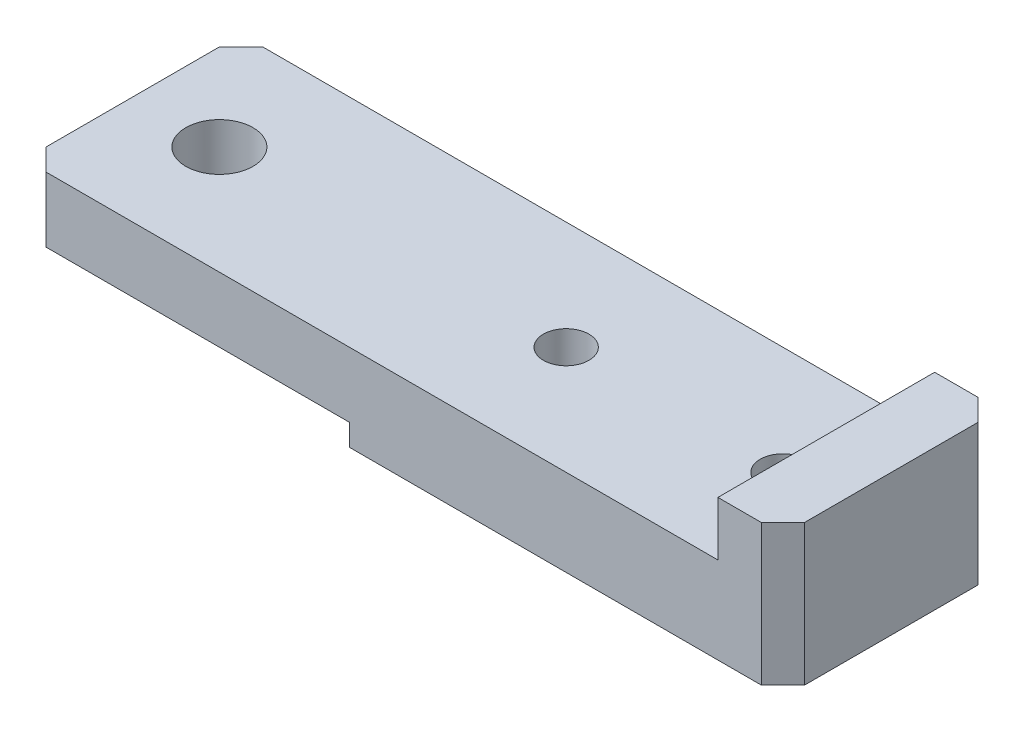
ISO-10303-21;
HEADER;
FILE_DESCRIPTION(('STEP AP214'),'2;1');
FILE_NAME('part.step','',(''),(''),'','','');
FILE_SCHEMA(('AUTOMOTIVE_DESIGN { 1 0 10303 214 1 1 1 1 }'));
ENDSEC;
DATA;
#1=APPLICATION_CONTEXT('core data for automotive mechanical design processes');
#2=APPLICATION_PROTOCOL_DEFINITION('international standard','automotive_design',2000,#1);
#3=PRODUCT_CONTEXT('',#1,'mechanical');
#4=PRODUCT('Part','Part','',(#3));
#5=PRODUCT_RELATED_PRODUCT_CATEGORY('part','',(#4));
#6=PRODUCT_DEFINITION_FORMATION('','',#4);
#7=PRODUCT_DEFINITION_CONTEXT('part definition',#1,'design');
#8=PRODUCT_DEFINITION('design','',#6,#7);
#9=PRODUCT_DEFINITION_SHAPE('','',#8);
#10=(LENGTH_UNIT() NAMED_UNIT(*) SI_UNIT(.MILLI.,.METRE.));
#11=(NAMED_UNIT(*) PLANE_ANGLE_UNIT() SI_UNIT($,.RADIAN.));
#12=(NAMED_UNIT(*) SI_UNIT($,.STERADIAN.) SOLID_ANGLE_UNIT());
#13=UNCERTAINTY_MEASURE_WITH_UNIT(LENGTH_MEASURE(1.E-05),#10,'distance_accuracy_value','');
#14=(GEOMETRIC_REPRESENTATION_CONTEXT(3) GLOBAL_UNCERTAINTY_ASSIGNED_CONTEXT((#13)) GLOBAL_UNIT_ASSIGNED_CONTEXT((#10,
#11,#12)) REPRESENTATION_CONTEXT('',''));
#15=CARTESIAN_POINT('',(0.,0.,0.));
#16=DIRECTION('',(0.,0.,1.));
#17=DIRECTION('',(1.,0.,0.));
#18=AXIS2_PLACEMENT_3D('',#15,#16,#17);
#19=CARTESIAN_POINT('',(64.,15.,10.));
#20=DIRECTION('',(1.,0.,0.));
#21=DIRECTION('',(0.,0.,-1.));
#22=AXIS2_PLACEMENT_3D('',#19,#20,#21);
#23=PLANE('',#22);
#24=DIRECTION('',(0.,-1.,0.));
#25=VECTOR('',#24,1.);
#26=CARTESIAN_POINT('',(64.,15.,-10.));
#27=LINE('',#26,#25);
#28=CARTESIAN_POINT('',(64.,15.,-10.));
#29=VERTEX_POINT('',#28);
#30=CARTESIAN_POINT('',(64.,10.,-10.));
#31=VERTEX_POINT('',#30);
#32=EDGE_CURVE('E164',#29,#31,#27,.T.);
#33=ORIENTED_EDGE('',*,*,#32,.T.);
#34=DIRECTION('',(0.,0.,-1.));
#35=VECTOR('',#34,1.);
#36=CARTESIAN_POINT('',(64.,10.,10.));
#37=LINE('',#36,#35);
#38=CARTESIAN_POINT('',(64.,10.,10.));
#39=VERTEX_POINT('',#38);
#40=EDGE_CURVE('E140',#39,#31,#37,.T.);
#41=ORIENTED_EDGE('',*,*,#40,.F.);
#42=DIRECTION('',(0.,-1.,0.));
#43=VECTOR('',#42,1.);
#44=CARTESIAN_POINT('',(64.,15.,10.));
#45=LINE('',#44,#43);
#46=CARTESIAN_POINT('',(64.,15.,10.));
#47=VERTEX_POINT('',#46);
#48=EDGE_CURVE('E150',#47,#39,#45,.T.);
#49=ORIENTED_EDGE('',*,*,#48,.F.);
#50=DIRECTION('',(0.,0.,-1.));
#51=VECTOR('',#50,1.);
#52=CARTESIAN_POINT('',(64.,15.,10.));
#53=LINE('',#52,#51);
#54=EDGE_CURVE('E287',#47,#29,#53,.T.);
#55=ORIENTED_EDGE('',*,*,#54,.T.);
#56=EDGE_LOOP('',(#33,#41,#49,#55));
#57=FACE_BOUND('',#56,.T.);
#58=ADVANCED_FACE('F41',(#57),#23,.F.);
#59=CARTESIAN_POINT('',(0.,10.,10.));
#60=DIRECTION('',(0.,-1.,0.));
#61=DIRECTION('',(0.,0.,-1.));
#62=AXIS2_PLACEMENT_3D('',#59,#60,#61);
#63=PLANE('',#62);
#64=CARTESIAN_POINT('',(8.,10.,0.));
#65=DIRECTION('',(0.,-1.,0.));
#66=DIRECTION('',(0.,0.,-1.));
#67=AXIS2_PLACEMENT_3D('',#64,#65,#66);
#68=CIRCLE('',#67,3.1);
#69=CARTESIAN_POINT('',(8.,10.,-3.1));
#70=VERTEX_POINT('',#69);
#71=EDGE_CURVE('E355',#70,#70,#68,.T.);
#72=ORIENTED_EDGE('',*,*,#71,.T.);
#73=EDGE_LOOP('',(#72));
#74=FACE_BOUND('',#73,.T.);
#75=CARTESIAN_POINT('',(60.,10.,0.));
#76=DIRECTION('',(0.,-1.,0.));
#77=DIRECTION('',(0.,0.,-1.));
#78=AXIS2_PLACEMENT_3D('',#75,#76,#77);
#79=CIRCLE('',#78,2.1);
#80=CARTESIAN_POINT('',(60.,10.,-2.1));
#81=VERTEX_POINT('',#80);
#82=EDGE_CURVE('E347',#81,#81,#79,.T.);
#83=ORIENTED_EDGE('',*,*,#82,.T.);
#84=EDGE_LOOP('',(#83));
#85=FACE_BOUND('',#84,.T.);
#86=CARTESIAN_POINT('',(40.,10.,0.));
#87=DIRECTION('',(0.,-1.,0.));
#88=DIRECTION('',(0.,0.,-1.));
#89=AXIS2_PLACEMENT_3D('',#86,#87,#88);
#90=CIRCLE('',#89,2.1);
#91=CARTESIAN_POINT('',(40.,10.,-2.1));
#92=VERTEX_POINT('',#91);
#93=EDGE_CURVE('E351',#92,#92,#90,.T.);
#94=ORIENTED_EDGE('',*,*,#93,.T.);
#95=EDGE_LOOP('',(#94));
#96=FACE_BOUND('',#95,.T.);
#97=DIRECTION('',(-1.,0.,0.));
#98=VECTOR('',#97,1.);
#99=CARTESIAN_POINT('',(0.,10.,-10.));
#100=LINE('',#99,#98);
#101=CARTESIAN_POINT('',(2.,10.,-10.));
#102=VERTEX_POINT('',#101);
#103=EDGE_CURVE('E300',#31,#102,#100,.T.);
#104=ORIENTED_EDGE('',*,*,#103,.T.);
#105=DIRECTION('',(0.707106781186549,0.,-0.707106781186546));
#106=VECTOR('',#105,1.);
#107=CARTESIAN_POINT('',(0.,10.,-8.00000000000001));
#108=LINE('',#107,#106);
#109=CARTESIAN_POINT('',(0.,10.,-8.00000000000001));
#110=VERTEX_POINT('',#109);
#111=EDGE_CURVE('E192',#102,#110,#108,.F.);
#112=ORIENTED_EDGE('',*,*,#111,.T.);
#113=DIRECTION('',(0.,0.,-1.));
#114=VECTOR('',#113,1.);
#115=CARTESIAN_POINT('',(0.,10.,10.));
#116=LINE('',#115,#114);
#117=CARTESIAN_POINT('',(0.,10.,8.));
#118=VERTEX_POINT('',#117);
#119=EDGE_CURVE('E167',#118,#110,#116,.T.);
#120=ORIENTED_EDGE('',*,*,#119,.F.);
#121=DIRECTION('',(0.707106781186546,0.,0.707106781186549));
#122=VECTOR('',#121,1.);
#123=CARTESIAN_POINT('',(1.99999999999999,10.,10.));
#124=LINE('',#123,#122);
#125=CARTESIAN_POINT('',(1.99999999999999,10.,10.));
#126=VERTEX_POINT('',#125);
#127=EDGE_CURVE('E144',#118,#126,#124,.T.);
#128=ORIENTED_EDGE('',*,*,#127,.T.);
#129=DIRECTION('',(-1.,0.,0.));
#130=VECTOR('',#129,1.);
#131=CARTESIAN_POINT('',(0.,10.,10.));
#132=LINE('',#131,#130);
#133=EDGE_CURVE('E135',#39,#126,#132,.T.);
#134=ORIENTED_EDGE('',*,*,#133,.F.);
#135=ORIENTED_EDGE('',*,*,#40,.T.);
#136=EDGE_LOOP('',(#104,#112,#120,#128,#134,#135));
#137=FACE_BOUND('',#136,.T.);
#138=ADVANCED_FACE('F138',(#74,#85,#96,#137),#63,.F.);
#139=CARTESIAN_POINT('',(0.,4.,10.));
#140=DIRECTION('',(1.,0.,0.));
#141=DIRECTION('',(0.,1.,0.));
#142=AXIS2_PLACEMENT_3D('',#139,#140,#141);
#143=PLANE('',#142);
#144=ORIENTED_EDGE('',*,*,#119,.T.);
#145=DIRECTION('',(0.,-1.,0.));
#146=VECTOR('',#145,1.);
#147=CARTESIAN_POINT('',(0.,4.,-8.00000000000001));
#148=LINE('',#147,#146);
#149=CARTESIAN_POINT('',(0.,4.,-8.00000000000001));
#150=VERTEX_POINT('',#149);
#151=EDGE_CURVE('E171',#110,#150,#148,.T.);
#152=ORIENTED_EDGE('',*,*,#151,.T.);
#153=DIRECTION('',(0.,0.,-1.));
#154=VECTOR('',#153,1.);
#155=CARTESIAN_POINT('',(0.,4.,10.));
#156=LINE('',#155,#154);
#157=CARTESIAN_POINT('',(0.,4.,8.));
#158=VERTEX_POINT('',#157);
#159=EDGE_CURVE('E174',#158,#150,#156,.T.);
#160=ORIENTED_EDGE('',*,*,#159,.F.);
#161=DIRECTION('',(0.,1.,0.));
#162=VECTOR('',#161,1.);
#163=CARTESIAN_POINT('',(0.,10.,8.));
#164=LINE('',#163,#162);
#165=EDGE_CURVE('E166',#158,#118,#164,.T.);
#166=ORIENTED_EDGE('',*,*,#165,.T.);
#167=EDGE_LOOP('',(#144,#152,#160,#166));
#168=FACE_BOUND('',#167,.T.);
#169=ADVANCED_FACE('F242',(#168),#143,.F.);
#170=CARTESIAN_POINT('',(0.,4.,10.));
#171=DIRECTION('',(0.,1.,0.));
#172=DIRECTION('',(0.,0.,1.));
#173=AXIS2_PLACEMENT_3D('',#170,#171,#172);
#174=PLANE('',#173);
#175=CARTESIAN_POINT('',(8.,4.,0.));
#176=DIRECTION('',(0.,1.,0.));
#177=DIRECTION('',(0.,0.,1.));
#178=AXIS2_PLACEMENT_3D('',#175,#176,#177);
#179=CIRCLE('',#178,6.);
#180=CARTESIAN_POINT('',(8.,4.,6.));
#181=VERTEX_POINT('',#180);
#182=EDGE_CURVE('E11',#181,#181,#179,.T.);
#183=ORIENTED_EDGE('',*,*,#182,.T.);
#184=EDGE_LOOP('',(#183));
#185=FACE_BOUND('',#184,.T.);
#186=ORIENTED_EDGE('',*,*,#159,.T.);
#187=DIRECTION('',(-0.707106781186549,0.,0.707106781186546));
#188=VECTOR('',#187,1.);
#189=CARTESIAN_POINT('',(0.,4.,-8.00000000000001));
#190=LINE('',#189,#188);
#191=CARTESIAN_POINT('',(2.,4.,-10.));
#192=VERTEX_POINT('',#191);
#193=EDGE_CURVE('E184',#150,#192,#190,.F.);
#194=ORIENTED_EDGE('',*,*,#193,.T.);
#195=DIRECTION('',(1.,0.,0.));
#196=VECTOR('',#195,1.);
#197=CARTESIAN_POINT('',(0.,4.,-10.));
#198=LINE('',#197,#196);
#199=CARTESIAN_POINT('',(30.,4.,-10.));
#200=VERTEX_POINT('',#199);
#201=EDGE_CURVE('E304',#192,#200,#198,.T.);
#202=ORIENTED_EDGE('',*,*,#201,.T.);
#203=DIRECTION('',(0.,0.,-1.));
#204=VECTOR('',#203,1.);
#205=CARTESIAN_POINT('',(30.,4.,10.));
#206=LINE('',#205,#204);
#207=CARTESIAN_POINT('',(30.,4.,10.));
#208=VERTEX_POINT('',#207);
#209=EDGE_CURVE('E325',#208,#200,#206,.T.);
#210=ORIENTED_EDGE('',*,*,#209,.F.);
#211=DIRECTION('',(1.,0.,0.));
#212=VECTOR('',#211,1.);
#213=CARTESIAN_POINT('',(0.,4.,10.));
#214=LINE('',#213,#212);
#215=CARTESIAN_POINT('',(1.99999999999999,4.,10.));
#216=VERTEX_POINT('',#215);
#217=EDGE_CURVE('E149',#216,#208,#214,.T.);
#218=ORIENTED_EDGE('',*,*,#217,.F.);
#219=DIRECTION('',(-0.707106781186546,0.,-0.707106781186549));
#220=VECTOR('',#219,1.);
#221=CARTESIAN_POINT('',(1.99999999999999,4.,10.));
#222=LINE('',#221,#220);
#223=EDGE_CURVE('E181',#216,#158,#222,.T.);
#224=ORIENTED_EDGE('',*,*,#223,.T.);
#225=EDGE_LOOP('',(#186,#194,#202,#210,#218,#224));
#226=FACE_BOUND('',#225,.T.);
#227=ADVANCED_FACE('F332',(#185,#226),#174,.F.);
#228=CARTESIAN_POINT('',(30.,4.,10.));
#229=DIRECTION('',(1.,0.,0.));
#230=DIRECTION('',(0.,0.,-1.));
#231=AXIS2_PLACEMENT_3D('',#228,#229,#230);
#232=PLANE('',#231);
#233=DIRECTION('',(0.,-1.,0.));
#234=VECTOR('',#233,1.);
#235=CARTESIAN_POINT('',(30.,4.,-10.));
#236=LINE('',#235,#234);
#237=CARTESIAN_POINT('',(30.,2.,-10.));
#238=VERTEX_POINT('',#237);
#239=EDGE_CURVE('E307',#200,#238,#236,.T.);
#240=ORIENTED_EDGE('',*,*,#239,.T.);
#241=DIRECTION('',(0.,0.,-1.));
#242=VECTOR('',#241,1.);
#243=CARTESIAN_POINT('',(30.,2.,10.));
#244=LINE('',#243,#242);
#245=CARTESIAN_POINT('',(30.,2.,10.));
#246=VERTEX_POINT('',#245);
#247=EDGE_CURVE('E321',#246,#238,#244,.T.);
#248=ORIENTED_EDGE('',*,*,#247,.F.);
#249=DIRECTION('',(0.,-1.,0.));
#250=VECTOR('',#249,1.);
#251=CARTESIAN_POINT('',(30.,4.,10.));
#252=LINE('',#251,#250);
#253=EDGE_CURVE('E294',#208,#246,#252,.T.);
#254=ORIENTED_EDGE('',*,*,#253,.F.);
#255=ORIENTED_EDGE('',*,*,#209,.T.);
#256=EDGE_LOOP('',(#240,#248,#254,#255));
#257=FACE_BOUND('',#256,.T.);
#258=ADVANCED_FACE('F377',(#257),#232,.F.);
#259=CARTESIAN_POINT('',(70.,2.,10.));
#260=DIRECTION('',(0.,1.,0.));
#261=DIRECTION('',(-1.,0.,0.));
#262=AXIS2_PLACEMENT_3D('',#259,#260,#261);
#263=PLANE('',#262);
#264=CARTESIAN_POINT('',(60.,2.,0.));
#265=DIRECTION('',(0.,-1.,0.));
#266=DIRECTION('',(1.,0.,0.));
#267=AXIS2_PLACEMENT_3D('',#264,#265,#266);
#268=CIRCLE('',#267,2.1);
#269=CARTESIAN_POINT('',(62.1,2.,0.));
#270=VERTEX_POINT('',#269);
#271=EDGE_CURVE('E363',#270,#270,#268,.T.);
#272=ORIENTED_EDGE('',*,*,#271,.F.);
#273=EDGE_LOOP('',(#272));
#274=FACE_BOUND('',#273,.T.);
#275=CARTESIAN_POINT('',(40.,2.,0.));
#276=DIRECTION('',(0.,-1.,0.));
#277=DIRECTION('',(1.,0.,0.));
#278=AXIS2_PLACEMENT_3D('',#275,#276,#277);
#279=CIRCLE('',#278,2.1);
#280=CARTESIAN_POINT('',(42.1,2.,0.));
#281=VERTEX_POINT('',#280);
#282=EDGE_CURVE('E359',#281,#281,#279,.T.);
#283=ORIENTED_EDGE('',*,*,#282,.F.);
#284=EDGE_LOOP('',(#283));
#285=FACE_BOUND('',#284,.T.);
#286=DIRECTION('',(1.,0.,0.));
#287=VECTOR('',#286,1.);
#288=CARTESIAN_POINT('',(70.,2.,-10.));
#289=LINE('',#288,#287);
#290=CARTESIAN_POINT('',(68.,2.,-10.));
#291=VERTEX_POINT('',#290);
#292=EDGE_CURVE('E310',#238,#291,#289,.T.);
#293=ORIENTED_EDGE('',*,*,#292,.T.);
#294=DIRECTION('',(-0.707106781186549,0.,-0.707106781186546));
#295=VECTOR('',#294,1.);
#296=CARTESIAN_POINT('',(70.,2.,-8.00000000000001));
#297=LINE('',#296,#295);
#298=CARTESIAN_POINT('',(70.,2.,-8.00000000000001));
#299=VERTEX_POINT('',#298);
#300=EDGE_CURVE('E215',#291,#299,#297,.F.);
#301=ORIENTED_EDGE('',*,*,#300,.T.);
#302=DIRECTION('',(0.,0.,-1.));
#303=VECTOR('',#302,1.);
#304=CARTESIAN_POINT('',(70.,2.,10.));
#305=LINE('',#304,#303);
#306=CARTESIAN_POINT('',(70.,2.,7.99999999999999));
#307=VERTEX_POINT('',#306);
#308=EDGE_CURVE('E317',#307,#299,#305,.T.);
#309=ORIENTED_EDGE('',*,*,#308,.F.);
#310=DIRECTION('',(-0.707106781186544,0.,0.707106781186551));
#311=VECTOR('',#310,1.);
#312=CARTESIAN_POINT('',(68.,2.,10.));
#313=LINE('',#312,#311);
#314=CARTESIAN_POINT('',(68.,2.,10.));
#315=VERTEX_POINT('',#314);
#316=EDGE_CURVE('E57',#307,#315,#313,.T.);
#317=ORIENTED_EDGE('',*,*,#316,.T.);
#318=DIRECTION('',(1.,0.,0.));
#319=VECTOR('',#318,1.);
#320=CARTESIAN_POINT('',(70.,2.,10.));
#321=LINE('',#320,#319);
#322=EDGE_CURVE('E282',#246,#315,#321,.T.);
#323=ORIENTED_EDGE('',*,*,#322,.F.);
#324=ORIENTED_EDGE('',*,*,#247,.T.);
#325=EDGE_LOOP('',(#293,#301,#309,#317,#323,#324));
#326=FACE_BOUND('',#325,.T.);
#327=ADVANCED_FACE('F373',(#274,#285,#326),#263,.F.);
#328=CARTESIAN_POINT('',(70.,10.,10.));
#329=DIRECTION('',(-1.,0.,0.));
#330=DIRECTION('',(0.,0.,1.));
#331=AXIS2_PLACEMENT_3D('',#328,#329,#330);
#332=PLANE('',#331);
#333=ORIENTED_EDGE('',*,*,#308,.T.);
#334=DIRECTION('',(0.,1.,0.));
#335=VECTOR('',#334,1.);
#336=CARTESIAN_POINT('',(70.,10.,-8.00000000000001));
#337=LINE('',#336,#335);
#338=CARTESIAN_POINT('',(70.,15.,-8.00000000000001));
#339=VERTEX_POINT('',#338);
#340=EDGE_CURVE('E201',#299,#339,#337,.T.);
#341=ORIENTED_EDGE('',*,*,#340,.T.);
#342=DIRECTION('',(0.,0.,-1.));
#343=VECTOR('',#342,1.);
#344=CARTESIAN_POINT('',(70.,15.,10.));
#345=LINE('',#344,#343);
#346=CARTESIAN_POINT('',(70.,15.,7.99999999999999));
#347=VERTEX_POINT('',#346);
#348=EDGE_CURVE('E292',#347,#339,#345,.T.);
#349=ORIENTED_EDGE('',*,*,#348,.F.);
#350=DIRECTION('',(0.,-1.,0.));
#351=VECTOR('',#350,1.);
#352=CARTESIAN_POINT('',(70.,2.,7.99999999999999));
#353=LINE('',#352,#351);
#354=EDGE_CURVE('E198',#347,#307,#353,.T.);
#355=ORIENTED_EDGE('',*,*,#354,.T.);
#356=EDGE_LOOP('',(#333,#341,#349,#355));
#357=FACE_BOUND('',#356,.T.);
#358=ADVANCED_FACE('F376',(#357),#332,.F.);
#359=CARTESIAN_POINT('',(70.,15.,10.));
#360=DIRECTION('',(0.,-1.,0.));
#361=DIRECTION('',(0.,0.,-1.));
#362=AXIS2_PLACEMENT_3D('',#359,#360,#361);
#363=PLANE('',#362);
#364=ORIENTED_EDGE('',*,*,#348,.T.);
#365=DIRECTION('',(0.707106781186549,0.,0.707106781186546));
#366=VECTOR('',#365,1.);
#367=CARTESIAN_POINT('',(70.,15.,-8.00000000000001));
#368=LINE('',#367,#366);
#369=CARTESIAN_POINT('',(68.,15.,-10.));
#370=VERTEX_POINT('',#369);
#371=EDGE_CURVE('E208',#339,#370,#368,.F.);
#372=ORIENTED_EDGE('',*,*,#371,.T.);
#373=DIRECTION('',(-1.,0.,0.));
#374=VECTOR('',#373,1.);
#375=CARTESIAN_POINT('',(70.,15.,-10.));
#376=LINE('',#375,#374);
#377=EDGE_CURVE('E161',#370,#29,#376,.T.);
#378=ORIENTED_EDGE('',*,*,#377,.T.);
#379=ORIENTED_EDGE('',*,*,#54,.F.);
#380=DIRECTION('',(-1.,0.,0.));
#381=VECTOR('',#380,1.);
#382=CARTESIAN_POINT('',(70.,15.,10.));
#383=LINE('',#382,#381);
#384=CARTESIAN_POINT('',(68.,15.,10.));
#385=VERTEX_POINT('',#384);
#386=EDGE_CURVE('E156',#385,#47,#383,.T.);
#387=ORIENTED_EDGE('',*,*,#386,.F.);
#388=DIRECTION('',(0.707106781186544,0.,-0.707106781186551));
#389=VECTOR('',#388,1.);
#390=CARTESIAN_POINT('',(68.,15.,10.));
#391=LINE('',#390,#389);
#392=EDGE_CURVE('E205',#385,#347,#391,.T.);
#393=ORIENTED_EDGE('',*,*,#392,.T.);
#394=EDGE_LOOP('',(#364,#372,#378,#379,#387,#393));
#395=FACE_BOUND('',#394,.T.);
#396=ADVANCED_FACE('F285',(#395),#363,.F.);
#397=CARTESIAN_POINT('',(0.,0.,10.));
#398=DIRECTION('',(0.,0.,1.));
#399=DIRECTION('',(1.,0.,0.));
#400=AXIS2_PLACEMENT_3D('',#397,#398,#399);
#401=PLANE('',#400);
#402=ORIENTED_EDGE('',*,*,#322,.T.);
#403=DIRECTION('',(0.,1.,0.));
#404=VECTOR('',#403,1.);
#405=CARTESIAN_POINT('',(68.,15.,10.));
#406=LINE('',#405,#404);
#407=EDGE_CURVE('E218',#315,#385,#406,.T.);
#408=ORIENTED_EDGE('',*,*,#407,.T.);
#409=ORIENTED_EDGE('',*,*,#386,.T.);
#410=ORIENTED_EDGE('',*,*,#48,.T.);
#411=ORIENTED_EDGE('',*,*,#133,.T.);
#412=DIRECTION('',(0.,-1.,0.));
#413=VECTOR('',#412,1.);
#414=CARTESIAN_POINT('',(1.99999999999999,4.,10.));
#415=LINE('',#414,#413);
#416=EDGE_CURVE('E195',#126,#216,#415,.T.);
#417=ORIENTED_EDGE('',*,*,#416,.T.);
#418=ORIENTED_EDGE('',*,*,#217,.T.);
#419=ORIENTED_EDGE('',*,*,#253,.T.);
#420=EDGE_LOOP('',(#402,#408,#409,#410,#411,#417,#418,#419));
#421=FACE_BOUND('',#420,.T.);
#422=ADVANCED_FACE('F153',(#421),#401,.T.);
#423=CARTESIAN_POINT('',(0.,0.,-10.));
#424=DIRECTION('',(0.,0.,1.));
#425=DIRECTION('',(1.,0.,0.));
#426=AXIS2_PLACEMENT_3D('',#423,#424,#425);
#427=PLANE('',#426);
#428=ORIENTED_EDGE('',*,*,#377,.F.);
#429=DIRECTION('',(0.,-1.,0.));
#430=VECTOR('',#429,1.);
#431=CARTESIAN_POINT('',(68.,0.,-10.));
#432=LINE('',#431,#430);
#433=EDGE_CURVE('E65',#370,#291,#432,.T.);
#434=ORIENTED_EDGE('',*,*,#433,.T.);
#435=ORIENTED_EDGE('',*,*,#292,.F.);
#436=ORIENTED_EDGE('',*,*,#239,.F.);
#437=ORIENTED_EDGE('',*,*,#201,.F.);
#438=DIRECTION('',(0.,1.,0.));
#439=VECTOR('',#438,1.);
#440=CARTESIAN_POINT('',(2.,0.,-10.));
#441=LINE('',#440,#439);
#442=EDGE_CURVE('E187',#192,#102,#441,.T.);
#443=ORIENTED_EDGE('',*,*,#442,.T.);
#444=ORIENTED_EDGE('',*,*,#103,.F.);
#445=ORIENTED_EDGE('',*,*,#32,.F.);
#446=EDGE_LOOP('',(#428,#434,#435,#436,#437,#443,#444,#445));
#447=FACE_BOUND('',#446,.T.);
#448=ADVANCED_FACE('F385',(#447),#427,.F.);
#449=CARTESIAN_POINT('',(8.,2.,0.));
#450=DIRECTION('',(0.,1.,0.));
#451=DIRECTION('',(0.,0.,1.));
#452=AXIS2_PLACEMENT_3D('',#449,#450,#451);
#453=CYLINDRICAL_SURFACE('',#452,5.);
#454=CARTESIAN_POINT('',(8.,3.,0.));
#455=DIRECTION('',(0.,1.,0.));
#456=DIRECTION('',(0.,0.,1.));
#457=AXIS2_PLACEMENT_3D('',#454,#455,#456);
#458=CIRCLE('',#457,5.);
#459=CARTESIAN_POINT('',(8.,3.,5.));
#460=VERTEX_POINT('',#459);
#461=EDGE_CURVE('E50',#460,#460,#458,.F.);
#462=ORIENTED_EDGE('',*,*,#461,.T.);
#463=EDGE_LOOP('',(#462));
#464=FACE_BOUND('',#463,.T.);
#465=CARTESIAN_POINT('',(8.,2.,0.));
#466=DIRECTION('',(0.,-1.,0.));
#467=DIRECTION('',(0.,0.,-1.));
#468=AXIS2_PLACEMENT_3D('',#465,#466,#467);
#469=CIRCLE('',#468,5.);
#470=CARTESIAN_POINT('',(8.,2.,-5.));
#471=VERTEX_POINT('',#470);
#472=EDGE_CURVE('E301',#471,#471,#469,.T.);
#473=ORIENTED_EDGE('',*,*,#472,.F.);
#474=EDGE_LOOP('',(#473));
#475=FACE_BOUND('',#474,.T.);
#476=ADVANCED_FACE('F224',(#464,#475),#453,.T.);
#477=CARTESIAN_POINT('',(8.,2.,0.));
#478=DIRECTION('',(0.,-1.,0.));
#479=DIRECTION('',(0.,0.,-1.));
#480=AXIS2_PLACEMENT_3D('',#477,#478,#479);
#481=PLANE('',#480);
#482=CARTESIAN_POINT('',(8.,1.99999999999999,0.));
#483=DIRECTION('',(0.,-1.,0.));
#484=DIRECTION('',(1.,0.,0.));
#485=AXIS2_PLACEMENT_3D('',#482,#483,#484);
#486=CIRCLE('',#485,3.1);
#487=CARTESIAN_POINT('',(11.1,1.99999999999999,0.));
#488=VERTEX_POINT('',#487);
#489=EDGE_CURVE('E364',#488,#488,#486,.T.);
#490=ORIENTED_EDGE('',*,*,#489,.F.);
#491=EDGE_LOOP('',(#490));
#492=FACE_BOUND('',#491,.T.);
#493=ORIENTED_EDGE('',*,*,#472,.T.);
#494=EDGE_LOOP('',(#493));
#495=FACE_BOUND('',#494,.T.);
#496=ADVANCED_FACE('F255',(#492,#495),#481,.T.);
#497=CARTESIAN_POINT('',(0.,4.,-8.00000000000001));
#498=DIRECTION('',(0.707106781186546,0.,0.707106781186549));
#499=DIRECTION('',(0.,-1.,0.));
#500=AXIS2_PLACEMENT_3D('',#497,#498,#499);
#501=PLANE('',#500);
#502=ORIENTED_EDGE('',*,*,#111,.F.);
#503=ORIENTED_EDGE('',*,*,#442,.F.);
#504=ORIENTED_EDGE('',*,*,#193,.F.);
#505=ORIENTED_EDGE('',*,*,#151,.F.);
#506=EDGE_LOOP('',(#502,#503,#504,#505));
#507=FACE_BOUND('',#506,.T.);
#508=ADVANCED_FACE('F248',(#507),#501,.F.);
#509=CARTESIAN_POINT('',(1.99999999999999,0.,10.));
#510=DIRECTION('',(-0.707106781186549,0.,0.707106781186546));
#511=DIRECTION('',(0.,1.,0.));
#512=AXIS2_PLACEMENT_3D('',#509,#510,#511);
#513=PLANE('',#512);
#514=ORIENTED_EDGE('',*,*,#127,.F.);
#515=ORIENTED_EDGE('',*,*,#165,.F.);
#516=ORIENTED_EDGE('',*,*,#223,.F.);
#517=ORIENTED_EDGE('',*,*,#416,.F.);
#518=EDGE_LOOP('',(#514,#515,#516,#517));
#519=FACE_BOUND('',#518,.T.);
#520=ADVANCED_FACE('F254',(#519),#513,.T.);
#521=CARTESIAN_POINT('',(70.,10.,-8.00000000000001));
#522=DIRECTION('',(-0.707106781186546,0.,0.707106781186549));
#523=DIRECTION('',(0.,1.,0.));
#524=AXIS2_PLACEMENT_3D('',#521,#522,#523);
#525=PLANE('',#524);
#526=ORIENTED_EDGE('',*,*,#300,.F.);
#527=ORIENTED_EDGE('',*,*,#433,.F.);
#528=ORIENTED_EDGE('',*,*,#371,.F.);
#529=ORIENTED_EDGE('',*,*,#340,.F.);
#530=EDGE_LOOP('',(#526,#527,#528,#529));
#531=FACE_BOUND('',#530,.T.);
#532=ADVANCED_FACE('F262',(#531),#525,.F.);
#533=CARTESIAN_POINT('',(68.,0.,10.));
#534=DIRECTION('',(0.707106781186551,0.,0.707106781186544));
#535=DIRECTION('',(0.,-1.,0.));
#536=AXIS2_PLACEMENT_3D('',#533,#534,#535);
#537=PLANE('',#536);
#538=ORIENTED_EDGE('',*,*,#316,.F.);
#539=ORIENTED_EDGE('',*,*,#354,.F.);
#540=ORIENTED_EDGE('',*,*,#392,.F.);
#541=ORIENTED_EDGE('',*,*,#407,.F.);
#542=EDGE_LOOP('',(#538,#539,#540,#541));
#543=FACE_BOUND('',#542,.T.);
#544=ADVANCED_FACE('F268',(#543),#537,.T.);
#545=CARTESIAN_POINT('',(8.,15.,0.));
#546=DIRECTION('',(0.,-1.,0.));
#547=DIRECTION('',(1.,0.,0.));
#548=AXIS2_PLACEMENT_3D('',#545,#546,#547);
#549=CYLINDRICAL_SURFACE('',#548,3.1);
#550=ORIENTED_EDGE('',*,*,#489,.T.);
#551=EDGE_LOOP('',(#550));
#552=FACE_BOUND('',#551,.T.);
#553=ORIENTED_EDGE('',*,*,#71,.F.);
#554=EDGE_LOOP('',(#553));
#555=FACE_BOUND('',#554,.T.);
#556=ADVANCED_FACE('F273',(#552,#555),#549,.F.);
#557=CARTESIAN_POINT('',(40.,15.,0.));
#558=DIRECTION('',(0.,-1.,0.));
#559=DIRECTION('',(1.,0.,0.));
#560=AXIS2_PLACEMENT_3D('',#557,#558,#559);
#561=CYLINDRICAL_SURFACE('',#560,2.1);
#562=ORIENTED_EDGE('',*,*,#282,.T.);
#563=EDGE_LOOP('',(#562));
#564=FACE_BOUND('',#563,.T.);
#565=ORIENTED_EDGE('',*,*,#93,.F.);
#566=EDGE_LOOP('',(#565));
#567=FACE_BOUND('',#566,.T.);
#568=ADVANCED_FACE('F233',(#564,#567),#561,.F.);
#569=CARTESIAN_POINT('',(60.,15.,0.));
#570=DIRECTION('',(0.,-1.,0.));
#571=DIRECTION('',(1.,0.,0.));
#572=AXIS2_PLACEMENT_3D('',#569,#570,#571);
#573=CYLINDRICAL_SURFACE('',#572,2.1);
#574=ORIENTED_EDGE('',*,*,#271,.T.);
#575=EDGE_LOOP('',(#574));
#576=FACE_BOUND('',#575,.T.);
#577=ORIENTED_EDGE('',*,*,#82,.F.);
#578=EDGE_LOOP('',(#577));
#579=FACE_BOUND('',#578,.T.);
#580=ADVANCED_FACE('F228',(#576,#579),#573,.F.);
#581=CARTESIAN_POINT('',(8.,3.,0.));
#582=DIRECTION('',(0.,1.,0.));
#583=DIRECTION('',(0.,0.,1.));
#584=AXIS2_PLACEMENT_3D('',#581,#582,#583);
#585=TOROIDAL_SURFACE('',#584,6.,1.);
#586=ORIENTED_EDGE('',*,*,#182,.F.);
#587=EDGE_LOOP('',(#586));
#588=FACE_BOUND('',#587,.T.);
#589=ORIENTED_EDGE('',*,*,#461,.F.);
#590=EDGE_LOOP('',(#589));
#591=FACE_BOUND('',#590,.T.);
#592=ADVANCED_FACE('F43',(#588,#591),#585,.F.);
#593=CLOSED_SHELL('',(#58,#138,#169,#227,#258,#327,#358,#396,#422,#448,#476,#496,#508,#520,#532,
#544,#556,#568,#580,#592));
#594=MANIFOLD_SOLID_BREP('B2',#593);
#595=ADVANCED_BREP_SHAPE_REPRESENTATION('',(#18,#594),#14);
#596=SHAPE_DEFINITION_REPRESENTATION(#9,#595);
ENDSEC;
END-ISO-10303-21;
